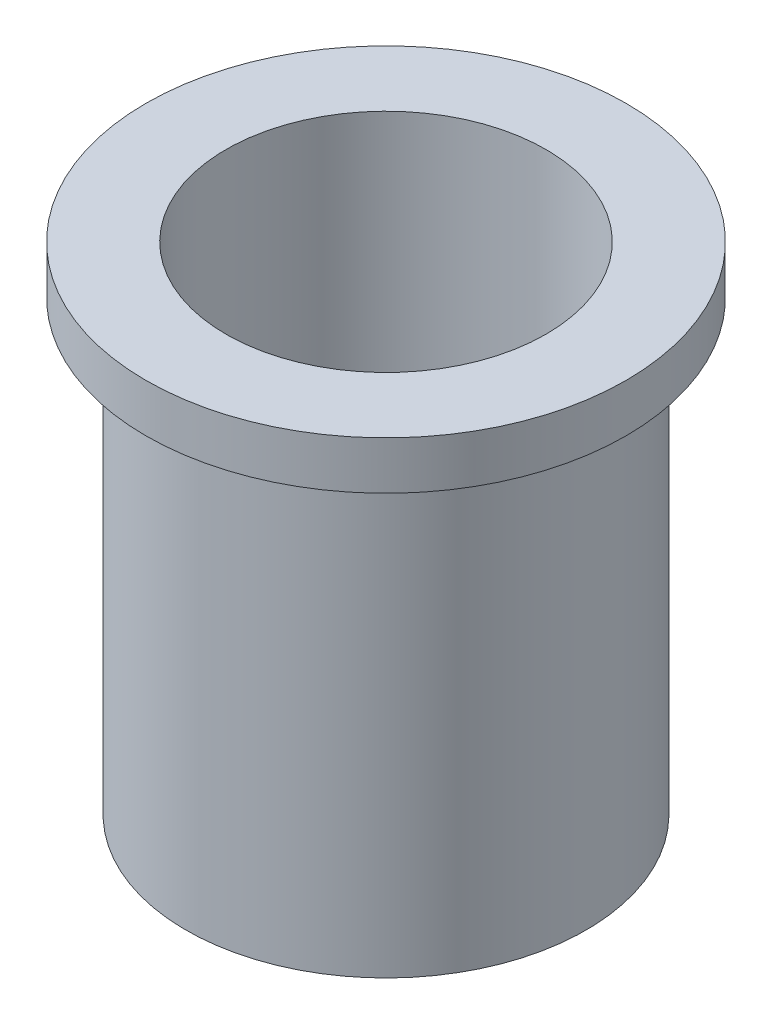
ISO-10303-21;
HEADER;
FILE_DESCRIPTION(('STEP AP214'),'2;1');
FILE_NAME('part.step','',(''),(''),'','','');
FILE_SCHEMA(('AUTOMOTIVE_DESIGN { 1 0 10303 214 1 1 1 1 }'));
ENDSEC;
DATA;
#1=APPLICATION_CONTEXT('core data for automotive mechanical design processes');
#2=APPLICATION_PROTOCOL_DEFINITION('international standard','automotive_design',2000,#1);
#3=PRODUCT_CONTEXT('',#1,'mechanical');
#4=PRODUCT('Part','Part','',(#3));
#5=PRODUCT_RELATED_PRODUCT_CATEGORY('part','',(#4));
#6=PRODUCT_DEFINITION_FORMATION('','',#4);
#7=PRODUCT_DEFINITION_CONTEXT('part definition',#1,'design');
#8=PRODUCT_DEFINITION('design','',#6,#7);
#9=PRODUCT_DEFINITION_SHAPE('','',#8);
#10=(LENGTH_UNIT() NAMED_UNIT(*) SI_UNIT(.MILLI.,.METRE.));
#11=(NAMED_UNIT(*) PLANE_ANGLE_UNIT() SI_UNIT($,.RADIAN.));
#12=(NAMED_UNIT(*) SI_UNIT($,.STERADIAN.) SOLID_ANGLE_UNIT());
#13=UNCERTAINTY_MEASURE_WITH_UNIT(LENGTH_MEASURE(1.E-05),#10,'distance_accuracy_value','');
#14=(GEOMETRIC_REPRESENTATION_CONTEXT(3) GLOBAL_UNCERTAINTY_ASSIGNED_CONTEXT((#13)) GLOBAL_UNIT_ASSIGNED_CONTEXT((#10,
#11,#12)) REPRESENTATION_CONTEXT('',''));
#15=CARTESIAN_POINT('',(0.,0.,0.));
#16=DIRECTION('',(0.,0.,1.));
#17=DIRECTION('',(1.,0.,0.));
#18=AXIS2_PLACEMENT_3D('',#15,#16,#17);
#19=CARTESIAN_POINT('',(6.21898366137685E-13,40.346949902686,0.));
#20=DIRECTION('',(0.,1.,0.));
#21=DIRECTION('',(-1.,0.,0.));
#22=AXIS2_PLACEMENT_3D('',#19,#20,#21);
#23=CYLINDRICAL_SURFACE('',#22,15.);
#24=CARTESIAN_POINT('',(6.35242736703099E-13,9.10810810810781,0.));
#25=DIRECTION('',(0.,1.,0.));
#26=DIRECTION('',(-1.,0.,0.));
#27=AXIS2_PLACEMENT_3D('',#24,#25,#26);
#28=CIRCLE('',#27,15.);
#29=CARTESIAN_POINT('',(-14.9999999999994,9.10810810810781,0.));
#30=VERTEX_POINT('',#29);
#31=EDGE_CURVE('E11',#30,#30,#28,.T.);
#32=ORIENTED_EDGE('',*,*,#31,.F.);
#33=EDGE_LOOP('',(#32));
#34=FACE_BOUND('',#33,.T.);
#35=CARTESIAN_POINT('',(6.36524253859193E-13,6.10810810810782,0.));
#36=DIRECTION('',(0.,1.,0.));
#37=DIRECTION('',(-1.,0.,0.));
#38=AXIS2_PLACEMENT_3D('',#35,#36,#37);
#39=CIRCLE('',#38,15.);
#40=CARTESIAN_POINT('',(-14.9999999999994,6.10810810810781,0.));
#41=VERTEX_POINT('',#40);
#42=EDGE_CURVE('E84',#41,#41,#39,.T.);
#43=ORIENTED_EDGE('',*,*,#42,.T.);
#44=EDGE_LOOP('',(#43));
#45=FACE_BOUND('',#44,.T.);
#46=ADVANCED_FACE('F61',(#34,#45),#23,.T.);
#47=CARTESIAN_POINT('',(15.0000000000006,9.10810810810782,0.));
#48=DIRECTION('',(0.,-1.,0.));
#49=DIRECTION('',(1.,0.,0.));
#50=AXIS2_PLACEMENT_3D('',#47,#48,#49);
#51=PLANE('',#50);
#52=CARTESIAN_POINT('',(0.,9.10810810810781,0.));
#53=DIRECTION('',(0.,-1.,0.));
#54=DIRECTION('',(1.,0.,0.));
#55=AXIS2_PLACEMENT_3D('',#52,#53,#54);
#56=CIRCLE('',#55,10.);
#57=CARTESIAN_POINT('',(10.,9.10810810810782,0.));
#58=VERTEX_POINT('',#57);
#59=EDGE_CURVE('E89',#58,#58,#56,.T.);
#60=ORIENTED_EDGE('',*,*,#59,.T.);
#61=EDGE_LOOP('',(#60));
#62=FACE_BOUND('',#61,.T.);
#63=ORIENTED_EDGE('',*,*,#31,.T.);
#64=EDGE_LOOP('',(#63));
#65=FACE_BOUND('',#64,.T.);
#66=ADVANCED_FACE('F99',(#62,#65),#51,.F.);
#67=CARTESIAN_POINT('',(12.5000000000002,-21.8918918918922,0.));
#68=DIRECTION('',(0.,1.,0.));
#69=DIRECTION('',(-1.,0.,0.));
#70=AXIS2_PLACEMENT_3D('',#67,#68,#69);
#71=PLANE('',#70);
#72=CARTESIAN_POINT('',(0.,-21.8918918918922,0.));
#73=DIRECTION('',(0.,-1.,0.));
#74=DIRECTION('',(1.,0.,0.));
#75=AXIS2_PLACEMENT_3D('',#72,#73,#74);
#76=CIRCLE('',#75,10.);
#77=CARTESIAN_POINT('',(10.,-21.8918918918922,0.));
#78=VERTEX_POINT('',#77);
#79=EDGE_CURVE('E91',#78,#78,#76,.T.);
#80=ORIENTED_EDGE('',*,*,#79,.F.);
#81=EDGE_LOOP('',(#80));
#82=FACE_BOUND('',#81,.T.);
#83=CARTESIAN_POINT('',(6.48485080649399E-13,-21.8918918918922,0.));
#84=DIRECTION('',(0.,1.,0.));
#85=DIRECTION('',(-1.,0.,0.));
#86=AXIS2_PLACEMENT_3D('',#83,#84,#85);
#87=CIRCLE('',#86,12.4999999999996);
#88=CARTESIAN_POINT('',(-12.4999999999989,-21.8918918918922,0.));
#89=VERTEX_POINT('',#88);
#90=EDGE_CURVE('E75',#89,#89,#87,.T.);
#91=ORIENTED_EDGE('',*,*,#90,.F.);
#92=EDGE_LOOP('',(#91));
#93=FACE_BOUND('',#92,.T.);
#94=ADVANCED_FACE('F109',(#82,#93),#71,.F.);
#95=CARTESIAN_POINT('',(6.21898366137685E-13,40.346949902686,0.));
#96=DIRECTION('',(0.,1.,0.));
#97=DIRECTION('',(-1.,0.,0.));
#98=AXIS2_PLACEMENT_3D('',#95,#96,#97);
#99=CYLINDRICAL_SURFACE('',#98,12.4999999999998);
#100=CARTESIAN_POINT('',(6.36524253859193E-13,6.10810810810782,0.));
#101=DIRECTION('',(0.,1.,0.));
#102=DIRECTION('',(-1.,0.,0.));
#103=AXIS2_PLACEMENT_3D('',#100,#101,#102);
#104=CIRCLE('',#103,12.5);
#105=CARTESIAN_POINT('',(-12.4999999999994,6.10810810810781,0.));
#106=VERTEX_POINT('',#105);
#107=EDGE_CURVE('E76',#106,#106,#104,.T.);
#108=ORIENTED_EDGE('',*,*,#107,.F.);
#109=EDGE_LOOP('',(#108));
#110=FACE_BOUND('',#109,.T.);
#111=ORIENTED_EDGE('',*,*,#90,.T.);
#112=EDGE_LOOP('',(#111));
#113=FACE_BOUND('',#112,.T.);
#114=ADVANCED_FACE('F115',(#110,#113),#99,.T.);
#115=CARTESIAN_POINT('',(12.5000000000006,6.10810810810782,0.));
#116=DIRECTION('',(0.,1.,0.));
#117=DIRECTION('',(-1.,0.,0.));
#118=AXIS2_PLACEMENT_3D('',#115,#116,#117);
#119=PLANE('',#118);
#120=ORIENTED_EDGE('',*,*,#42,.F.);
#121=EDGE_LOOP('',(#120));
#122=FACE_BOUND('',#121,.T.);
#123=ORIENTED_EDGE('',*,*,#107,.T.);
#124=EDGE_LOOP('',(#123));
#125=FACE_BOUND('',#124,.T.);
#126=ADVANCED_FACE('F103',(#122,#125),#119,.F.);
#127=CARTESIAN_POINT('',(0.,9.10810810810781,0.));
#128=DIRECTION('',(0.,-1.,0.));
#129=DIRECTION('',(1.,0.,0.));
#130=AXIS2_PLACEMENT_3D('',#127,#128,#129);
#131=CYLINDRICAL_SURFACE('',#130,10.);
#132=ORIENTED_EDGE('',*,*,#59,.F.);
#133=EDGE_LOOP('',(#132));
#134=FACE_BOUND('',#133,.T.);
#135=ORIENTED_EDGE('',*,*,#79,.T.);
#136=EDGE_LOOP('',(#135));
#137=FACE_BOUND('',#136,.T.);
#138=ADVANCED_FACE('F105',(#134,#137),#131,.F.);
#139=CLOSED_SHELL('',(#46,#66,#94,#114,#126,#138));
#140=MANIFOLD_SOLID_BREP('B2',#139);
#141=ADVANCED_BREP_SHAPE_REPRESENTATION('',(#18,#140),#14);
#142=SHAPE_DEFINITION_REPRESENTATION(#9,#141);
ENDSEC;
END-ISO-10303-21;
